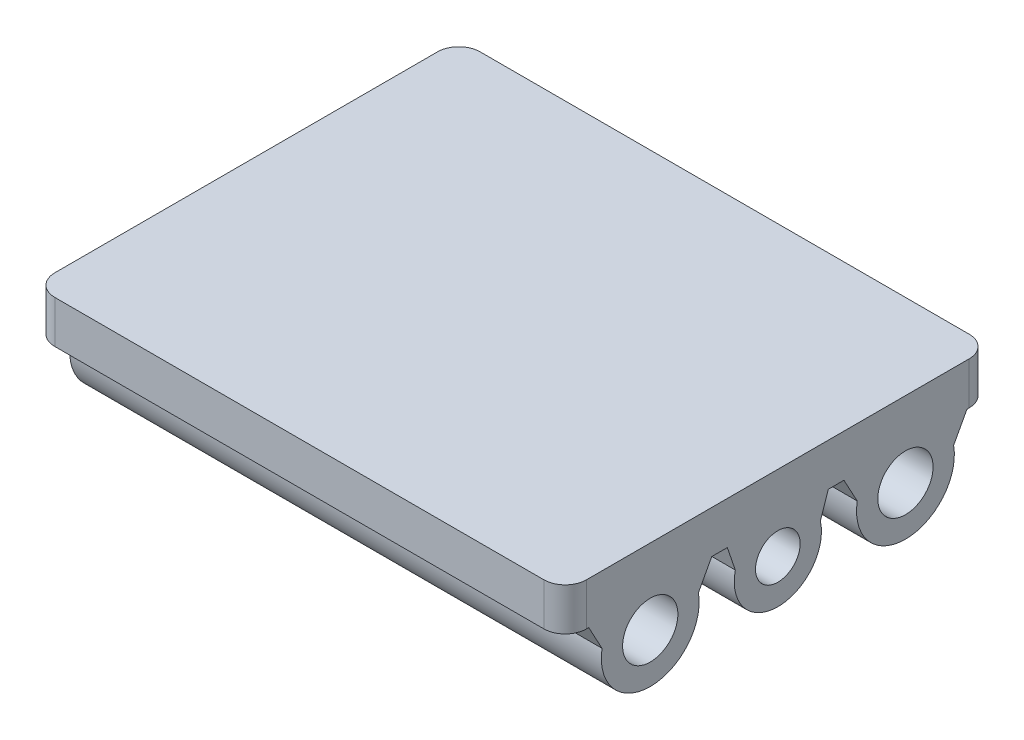
ISO-10303-21;
HEADER;
FILE_DESCRIPTION(('STEP AP214'),'2;1');
FILE_NAME('part.step','',(''),(''),'','','');
FILE_SCHEMA(('AUTOMOTIVE_DESIGN { 1 0 10303 214 1 1 1 1 }'));
ENDSEC;
DATA;
#1=APPLICATION_CONTEXT('core data for automotive mechanical design processes');
#2=APPLICATION_PROTOCOL_DEFINITION('international standard','automotive_design',2000,#1);
#3=PRODUCT_CONTEXT('',#1,'mechanical');
#4=PRODUCT('Part','Part','',(#3));
#5=PRODUCT_RELATED_PRODUCT_CATEGORY('part','',(#4));
#6=PRODUCT_DEFINITION_FORMATION('','',#4);
#7=PRODUCT_DEFINITION_CONTEXT('part definition',#1,'design');
#8=PRODUCT_DEFINITION('design','',#6,#7);
#9=PRODUCT_DEFINITION_SHAPE('','',#8);
#10=(LENGTH_UNIT() NAMED_UNIT(*) SI_UNIT(.MILLI.,.METRE.));
#11=(NAMED_UNIT(*) PLANE_ANGLE_UNIT() SI_UNIT($,.RADIAN.));
#12=(NAMED_UNIT(*) SI_UNIT($,.STERADIAN.) SOLID_ANGLE_UNIT());
#13=UNCERTAINTY_MEASURE_WITH_UNIT(LENGTH_MEASURE(1.E-05),#10,'distance_accuracy_value','');
#14=(GEOMETRIC_REPRESENTATION_CONTEXT(3) GLOBAL_UNCERTAINTY_ASSIGNED_CONTEXT((#13)) GLOBAL_UNIT_ASSIGNED_CONTEXT((#10,
#11,#12)) REPRESENTATION_CONTEXT('',''));
#15=CARTESIAN_POINT('',(0.,0.,0.));
#16=DIRECTION('',(0.,0.,1.));
#17=DIRECTION('',(1.,0.,0.));
#18=AXIS2_PLACEMENT_3D('',#15,#16,#17);
#19=CARTESIAN_POINT('',(0.,0.,0.));
#20=DIRECTION('',(0.,1.,0.));
#21=DIRECTION('',(0.,0.,1.));
#22=AXIS2_PLACEMENT_3D('',#19,#20,#21);
#23=PLANE('',#22);
#24=DIRECTION('',(0.,0.,1.));
#25=VECTOR('',#24,1.);
#26=CARTESIAN_POINT('',(-125.,0.,-100.));
#27=LINE('',#26,#25);
#28=CARTESIAN_POINT('',(-125.,0.,23.7559092261335));
#29=VERTEX_POINT('',#28);
#30=CARTESIAN_POINT('',(-125.,0.,31.0742017626146));
#31=VERTEX_POINT('',#30);
#32=EDGE_CURVE('E372',#29,#31,#27,.T.);
#33=ORIENTED_EDGE('',*,*,#32,.F.);
#34=DIRECTION('',(1.,0.,0.));
#35=VECTOR('',#34,1.);
#36=CARTESIAN_POINT('',(0.,0.,23.7559092261335));
#37=LINE('',#36,#35);
#38=CARTESIAN_POINT('',(125.,0.,23.7559092261335));
#39=VERTEX_POINT('',#38);
#40=EDGE_CURVE('E246',#29,#39,#37,.T.);
#41=ORIENTED_EDGE('',*,*,#40,.T.);
#42=DIRECTION('',(0.,0.,-1.));
#43=VECTOR('',#42,1.);
#44=CARTESIAN_POINT('',(125.,0.,-100.));
#45=LINE('',#44,#43);
#46=CARTESIAN_POINT('',(125.,0.,31.0742017626146));
#47=VERTEX_POINT('',#46);
#48=EDGE_CURVE('E381',#47,#39,#45,.T.);
#49=ORIENTED_EDGE('',*,*,#48,.F.);
#50=DIRECTION('',(-1.,0.,0.));
#51=VECTOR('',#50,1.);
#52=CARTESIAN_POINT('',(0.,0.,31.0742017626146));
#53=LINE('',#52,#51);
#54=EDGE_CURVE('E242',#47,#31,#53,.T.);
#55=ORIENTED_EDGE('',*,*,#54,.T.);
#56=EDGE_LOOP('',(#33,#41,#49,#55));
#57=FACE_BOUND('',#56,.T.);
#58=ADVANCED_FACE('F45',(#57),#23,.F.);
#59=DIRECTION('',(-1.,0.,0.));
#60=VECTOR('',#59,1.);
#61=CARTESIAN_POINT('',(-125.,0.,-100.));
#62=LINE('',#61,#60);
#63=CARTESIAN_POINT('',(115.,0.,-100.));
#64=VERTEX_POINT('',#63);
#65=CARTESIAN_POINT('',(-115.,0.,-100.));
#66=VERTEX_POINT('',#65);
#67=EDGE_CURVE('E375',#64,#66,#62,.T.);
#68=ORIENTED_EDGE('',*,*,#67,.F.);
#69=CARTESIAN_POINT('',(115.,0.,-90.));
#70=DIRECTION('',(0.,1.,0.));
#71=DIRECTION('',(0.,0.,1.));
#72=AXIS2_PLACEMENT_3D('',#69,#70,#71);
#73=CIRCLE('',#72,10.);
#74=CARTESIAN_POINT('',(125.,0.,-90.));
#75=VERTEX_POINT('',#74);
#76=EDGE_CURVE('E203',#64,#75,#73,.F.);
#77=ORIENTED_EDGE('',*,*,#76,.T.);
#78=CARTESIAN_POINT('',(125.,0.,-88.9257982373854));
#79=VERTEX_POINT('',#78);
#80=EDGE_CURVE('E189',#79,#75,#45,.T.);
#81=ORIENTED_EDGE('',*,*,#80,.F.);
#82=DIRECTION('',(-1.,0.,0.));
#83=VECTOR('',#82,1.);
#84=CARTESIAN_POINT('',(0.,0.,-88.9257982373854));
#85=LINE('',#84,#83);
#86=CARTESIAN_POINT('',(-125.,0.,-88.9257982373854));
#87=VERTEX_POINT('',#86);
#88=EDGE_CURVE('E202',#79,#87,#85,.T.);
#89=ORIENTED_EDGE('',*,*,#88,.T.);
#90=CARTESIAN_POINT('',(-125.,0.,-90.));
#91=VERTEX_POINT('',#90);
#92=EDGE_CURVE('E364',#91,#87,#27,.T.);
#93=ORIENTED_EDGE('',*,*,#92,.F.);
#94=CARTESIAN_POINT('',(-115.,0.,-90.));
#95=DIRECTION('',(0.,1.,0.));
#96=DIRECTION('',(0.,0.,1.));
#97=AXIS2_PLACEMENT_3D('',#94,#95,#96);
#98=CIRCLE('',#97,10.);
#99=EDGE_CURVE('E61',#91,#66,#98,.F.);
#100=ORIENTED_EDGE('',*,*,#99,.T.);
#101=EDGE_LOOP('',(#68,#77,#81,#89,#93,#100));
#102=FACE_BOUND('',#101,.T.);
#103=ADVANCED_FACE('F201',(#102),#23,.F.);
#104=CARTESIAN_POINT('',(-125.,0.,-31.0742017626146));
#105=VERTEX_POINT('',#104);
#106=CARTESIAN_POINT('',(-125.,0.,-23.7559092261335));
#107=VERTEX_POINT('',#106);
#108=EDGE_CURVE('E369',#105,#107,#27,.T.);
#109=ORIENTED_EDGE('',*,*,#108,.F.);
#110=DIRECTION('',(1.,0.,0.));
#111=VECTOR('',#110,1.);
#112=CARTESIAN_POINT('',(0.,0.,-31.0742017626146));
#113=LINE('',#112,#111);
#114=CARTESIAN_POINT('',(125.,0.,-31.0742017626146));
#115=VERTEX_POINT('',#114);
#116=EDGE_CURVE('E232',#105,#115,#113,.T.);
#117=ORIENTED_EDGE('',*,*,#116,.T.);
#118=CARTESIAN_POINT('',(125.,0.,-23.7559092261335));
#119=VERTEX_POINT('',#118);
#120=EDGE_CURVE('E205',#119,#115,#45,.T.);
#121=ORIENTED_EDGE('',*,*,#120,.F.);
#122=DIRECTION('',(-1.,0.,0.));
#123=VECTOR('',#122,1.);
#124=CARTESIAN_POINT('',(0.,0.,-23.7559092261335));
#125=LINE('',#124,#123);
#126=EDGE_CURVE('E228',#119,#107,#125,.T.);
#127=ORIENTED_EDGE('',*,*,#126,.T.);
#128=EDGE_LOOP('',(#109,#117,#121,#127));
#129=FACE_BOUND('',#128,.T.);
#130=ADVANCED_FACE('F436',(#129),#23,.F.);
#131=CARTESIAN_POINT('',(125.,20.,-100.));
#132=DIRECTION('',(-1.,0.,0.));
#133=DIRECTION('',(0.,0.,1.));
#134=AXIS2_PLACEMENT_3D('',#131,#132,#133);
#135=PLANE('',#134);
#136=DIRECTION('',(0.,0.,-1.));
#137=VECTOR('',#136,1.);
#138=CARTESIAN_POINT('',(125.,20.,-100.));
#139=LINE('',#138,#137);
#140=CARTESIAN_POINT('',(125.,20.,90.));
#141=VERTEX_POINT('',#140);
#142=CARTESIAN_POINT('',(125.,20.,-90.));
#143=VERTEX_POINT('',#142);
#144=EDGE_CURVE('E363',#141,#143,#139,.T.);
#145=ORIENTED_EDGE('',*,*,#144,.F.);
#146=DIRECTION('',(0.,-1.,0.));
#147=VECTOR('',#146,1.);
#148=CARTESIAN_POINT('',(125.,20.,90.));
#149=LINE('',#148,#147);
#150=CARTESIAN_POINT('',(125.,0.,90.));
#151=VERTEX_POINT('',#150);
#152=EDGE_CURVE('E294',#141,#151,#149,.T.);
#153=ORIENTED_EDGE('',*,*,#152,.T.);
#154=CARTESIAN_POINT('',(125.,0.,88.9257982373854));
#155=VERTEX_POINT('',#154);
#156=EDGE_CURVE('E208',#151,#155,#45,.T.);
#157=ORIENTED_EDGE('',*,*,#156,.T.);
#158=DIRECTION('',(0.,0.879546795665124,0.475812393948722));
#159=VECTOR('',#158,1.);
#160=CARTESIAN_POINT('',(125.,-63.5932566577629,54.5234675843087));
#161=LINE('',#160,#159);
#162=CARTESIAN_POINT('',(125.,-11.5769571786191,82.6629595380129));
#163=VERTEX_POINT('',#162);
#164=EDGE_CURVE('E285',#155,#163,#161,.F.);
#165=ORIENTED_EDGE('',*,*,#164,.T.);
#166=CARTESIAN_POINT('',(125.,-15.5,60.));
#167=DIRECTION('',(-1.,0.,0.));
#168=DIRECTION('',(0.,0.,1.));
#169=AXIS2_PLACEMENT_3D('',#166,#167,#168);
#170=CIRCLE('',#169,23.);
#171=CARTESIAN_POINT('',(125.,-11.5769571786191,37.337040461987));
#172=VERTEX_POINT('',#171);
#173=EDGE_CURVE('E415',#163,#172,#170,.F.);
#174=ORIENTED_EDGE('',*,*,#173,.T.);
#175=DIRECTION('',(0.,0.879546795665123,-0.475812393948722));
#176=VECTOR('',#175,1.);
#177=CARTESIAN_POINT('',(125.,70.3265086015489,-6.97064653957712));
#178=LINE('',#177,#176);
#179=EDGE_CURVE('E282',#172,#47,#178,.T.);
#180=ORIENTED_EDGE('',*,*,#179,.T.);
#181=ORIENTED_EDGE('',*,*,#48,.T.);
#182=DIRECTION('',(0.,0.946688793650123,0.322149542879196));
#183=VECTOR('',#182,1.);
#184=CARTESIAN_POINT('',(125.,-19.8181097906769,17.0119876199844));
#185=LINE('',#184,#183);
#186=CARTESIAN_POINT('',(125.,-11.0225071359586,20.005050803546));
#187=VERTEX_POINT('',#186);
#188=EDGE_CURVE('E273',#39,#187,#185,.F.);
#189=ORIENTED_EDGE('',*,*,#188,.T.);
#190=CARTESIAN_POINT('',(125.,-15.5,0.));
#191=DIRECTION('',(-1.,0.,0.));
#192=DIRECTION('',(0.,0.,1.));
#193=AXIS2_PLACEMENT_3D('',#190,#191,#192);
#194=CIRCLE('',#193,20.5);
#195=CARTESIAN_POINT('',(125.,-11.0225071359586,-20.0050508035461));
#196=VERTEX_POINT('',#195);
#197=EDGE_CURVE('E206',#187,#196,#194,.F.);
#198=ORIENTED_EDGE('',*,*,#197,.T.);
#199=DIRECTION('',(0.,0.946688793650123,-0.322149542879196));
#200=VECTOR('',#199,1.);
#201=CARTESIAN_POINT('',(125.,41.176962633972,-37.7680532154394));
#202=LINE('',#201,#200);
#203=EDGE_CURVE('E270',#196,#119,#202,.T.);
#204=ORIENTED_EDGE('',*,*,#203,.T.);
#205=ORIENTED_EDGE('',*,*,#120,.T.);
#206=DIRECTION('',(0.,0.879546795665124,0.475812393948722));
#207=VECTOR('',#206,1.);
#208=CARTESIAN_POINT('',(125.,-13.373344685521,-38.3088403074656));
#209=LINE('',#208,#207);
#210=CARTESIAN_POINT('',(125.,-11.5769571786191,-37.3370404619871));
#211=VERTEX_POINT('',#210);
#212=EDGE_CURVE('E197',#115,#211,#209,.F.);
#213=ORIENTED_EDGE('',*,*,#212,.T.);
#214=CARTESIAN_POINT('',(125.,-15.5,-60.));
#215=DIRECTION('',(-1.,0.,0.));
#216=DIRECTION('',(0.,0.,1.));
#217=AXIS2_PLACEMENT_3D('',#214,#215,#216);
#218=CIRCLE('',#217,23.);
#219=CARTESIAN_POINT('',(125.,-11.5769571786191,-82.662959538013));
#220=VERTEX_POINT('',#219);
#221=EDGE_CURVE('E192',#211,#220,#218,.F.);
#222=ORIENTED_EDGE('',*,*,#221,.T.);
#223=DIRECTION('',(0.,0.879546795665123,-0.475812393948722));
#224=VECTOR('',#223,1.);
#225=CARTESIAN_POINT('',(125.,20.106596629307,-99.8029544313515));
#226=LINE('',#225,#224);
#227=EDGE_CURVE('E184',#220,#79,#226,.T.);
#228=ORIENTED_EDGE('',*,*,#227,.T.);
#229=ORIENTED_EDGE('',*,*,#80,.T.);
#230=DIRECTION('',(0.,-1.,0.));
#231=VECTOR('',#230,1.);
#232=CARTESIAN_POINT('',(125.,20.,-90.));
#233=LINE('',#232,#231);
#234=EDGE_CURVE('E291',#75,#143,#233,.F.);
#235=ORIENTED_EDGE('',*,*,#234,.T.);
#236=EDGE_LOOP('',(#145,#153,#157,#165,#174,#180,#181,#189,#198,#204,#205,#213,#222,#228,#229,#235));
#237=FACE_BOUND('',#236,.T.);
#238=CARTESIAN_POINT('',(125.,-15.5,0.));
#239=DIRECTION('',(-1.,0.,0.));
#240=DIRECTION('',(0.,0.,1.));
#241=AXIS2_PLACEMENT_3D('',#238,#239,#240);
#242=CIRCLE('',#241,10.5);
#243=CARTESIAN_POINT('',(125.,-15.5,10.5));
#244=VERTEX_POINT('',#243);
#245=EDGE_CURVE('E385',#244,#244,#242,.F.);
#246=ORIENTED_EDGE('',*,*,#245,.F.);
#247=EDGE_LOOP('',(#246));
#248=FACE_BOUND('',#247,.T.);
#249=CARTESIAN_POINT('',(125.,-15.5,-60.));
#250=DIRECTION('',(-1.,0.,0.));
#251=DIRECTION('',(0.,0.,1.));
#252=AXIS2_PLACEMENT_3D('',#249,#250,#251);
#253=CIRCLE('',#252,13.);
#254=CARTESIAN_POINT('',(125.,-15.5,-47.));
#255=VERTEX_POINT('',#254);
#256=EDGE_CURVE('E403',#255,#255,#253,.F.);
#257=ORIENTED_EDGE('',*,*,#256,.F.);
#258=EDGE_LOOP('',(#257));
#259=FACE_BOUND('',#258,.T.);
#260=CARTESIAN_POINT('',(125.,-15.5,60.));
#261=DIRECTION('',(-1.,0.,0.));
#262=DIRECTION('',(0.,0.,1.));
#263=AXIS2_PLACEMENT_3D('',#260,#261,#262);
#264=CIRCLE('',#263,13.);
#265=CARTESIAN_POINT('',(125.,-15.5,73.));
#266=VERTEX_POINT('',#265);
#267=EDGE_CURVE('E419',#266,#266,#264,.F.);
#268=ORIENTED_EDGE('',*,*,#267,.F.);
#269=EDGE_LOOP('',(#268));
#270=FACE_BOUND('',#269,.T.);
#271=ADVANCED_FACE('F187',(#237,#248,#259,#270),#135,.F.);
#272=CARTESIAN_POINT('',(-125.,20.,-100.));
#273=DIRECTION('',(0.,0.,1.));
#274=DIRECTION('',(1.,0.,0.));
#275=AXIS2_PLACEMENT_3D('',#272,#273,#274);
#276=PLANE('',#275);
#277=DIRECTION('',(-1.,0.,0.));
#278=VECTOR('',#277,1.);
#279=CARTESIAN_POINT('',(-125.,20.,-100.));
#280=LINE('',#279,#278);
#281=CARTESIAN_POINT('',(115.,20.,-100.));
#282=VERTEX_POINT('',#281);
#283=CARTESIAN_POINT('',(-115.,20.,-100.));
#284=VERTEX_POINT('',#283);
#285=EDGE_CURVE('E351',#282,#284,#280,.T.);
#286=ORIENTED_EDGE('',*,*,#285,.F.);
#287=DIRECTION('',(0.,-1.,0.));
#288=VECTOR('',#287,1.);
#289=CARTESIAN_POINT('',(115.,20.,-100.));
#290=LINE('',#289,#288);
#291=EDGE_CURVE('E326',#282,#64,#290,.T.);
#292=ORIENTED_EDGE('',*,*,#291,.T.);
#293=ORIENTED_EDGE('',*,*,#67,.T.);
#294=DIRECTION('',(0.,-1.,0.));
#295=VECTOR('',#294,1.);
#296=CARTESIAN_POINT('',(-115.,20.,-100.));
#297=LINE('',#296,#295);
#298=EDGE_CURVE('E323',#66,#284,#297,.F.);
#299=ORIENTED_EDGE('',*,*,#298,.T.);
#300=EDGE_LOOP('',(#286,#292,#293,#299));
#301=FACE_BOUND('',#300,.T.);
#302=ADVANCED_FACE('F435',(#301),#276,.F.);
#303=CARTESIAN_POINT('',(-125.,20.,-100.));
#304=DIRECTION('',(1.,0.,0.));
#305=DIRECTION('',(0.,0.,-1.));
#306=AXIS2_PLACEMENT_3D('',#303,#304,#305);
#307=PLANE('',#306);
#308=DIRECTION('',(0.,0.,1.));
#309=VECTOR('',#308,1.);
#310=CARTESIAN_POINT('',(-125.,20.,-100.));
#311=LINE('',#310,#309);
#312=CARTESIAN_POINT('',(-125.,20.,-90.));
#313=VERTEX_POINT('',#312);
#314=CARTESIAN_POINT('',(-125.,20.,90.));
#315=VERTEX_POINT('',#314);
#316=EDGE_CURVE('E220',#313,#315,#311,.T.);
#317=ORIENTED_EDGE('',*,*,#316,.F.);
#318=DIRECTION('',(0.,-1.,0.));
#319=VECTOR('',#318,1.);
#320=CARTESIAN_POINT('',(-125.,20.,-90.));
#321=LINE('',#320,#319);
#322=EDGE_CURVE('E11',#313,#91,#321,.T.);
#323=ORIENTED_EDGE('',*,*,#322,.T.);
#324=ORIENTED_EDGE('',*,*,#92,.T.);
#325=DIRECTION('',(0.,-0.879546795665123,0.475812393948722));
#326=VECTOR('',#325,1.);
#327=CARTESIAN_POINT('',(-125.,20.106596629307,-99.8029544313515));
#328=LINE('',#327,#326);
#329=CARTESIAN_POINT('',(-125.,-11.5769571786191,-82.6629595380129));
#330=VERTEX_POINT('',#329);
#331=EDGE_CURVE('E198',#87,#330,#328,.T.);
#332=ORIENTED_EDGE('',*,*,#331,.T.);
#333=CARTESIAN_POINT('',(-125.,-15.5,-60.));
#334=DIRECTION('',(-1.,0.,0.));
#335=DIRECTION('',(0.,0.,1.));
#336=AXIS2_PLACEMENT_3D('',#333,#334,#335);
#337=CIRCLE('',#336,23.);
#338=CARTESIAN_POINT('',(-125.,-11.5769571786191,-37.337040461987));
#339=VERTEX_POINT('',#338);
#340=EDGE_CURVE('E408',#330,#339,#337,.T.);
#341=ORIENTED_EDGE('',*,*,#340,.T.);
#342=DIRECTION('',(0.,-0.879546795665124,-0.475812393948722));
#343=VECTOR('',#342,1.);
#344=CARTESIAN_POINT('',(-125.,-13.373344685521,-38.3088403074656));
#345=LINE('',#344,#343);
#346=EDGE_CURVE('E264',#339,#105,#345,.F.);
#347=ORIENTED_EDGE('',*,*,#346,.T.);
#348=ORIENTED_EDGE('',*,*,#108,.T.);
#349=DIRECTION('',(0.,-0.946688793650123,0.322149542879196));
#350=VECTOR('',#349,1.);
#351=CARTESIAN_POINT('',(-125.,41.176962633972,-37.7680532154394));
#352=LINE('',#351,#350);
#353=CARTESIAN_POINT('',(-125.,-11.0225071359586,-20.005050803546));
#354=VERTEX_POINT('',#353);
#355=EDGE_CURVE('E267',#107,#354,#352,.T.);
#356=ORIENTED_EDGE('',*,*,#355,.T.);
#357=CARTESIAN_POINT('',(-125.,-15.5,0.));
#358=DIRECTION('',(-1.,0.,0.));
#359=DIRECTION('',(0.,0.,1.));
#360=AXIS2_PLACEMENT_3D('',#357,#358,#359);
#361=CIRCLE('',#360,20.5);
#362=CARTESIAN_POINT('',(-125.,-11.0225071359586,20.0050508035461));
#363=VERTEX_POINT('',#362);
#364=EDGE_CURVE('E389',#354,#363,#361,.T.);
#365=ORIENTED_EDGE('',*,*,#364,.T.);
#366=DIRECTION('',(0.,-0.946688793650123,-0.322149542879196));
#367=VECTOR('',#366,1.);
#368=CARTESIAN_POINT('',(-125.,-19.8181097906769,17.0119876199845));
#369=LINE('',#368,#367);
#370=EDGE_CURVE('E276',#363,#29,#369,.F.);
#371=ORIENTED_EDGE('',*,*,#370,.T.);
#372=ORIENTED_EDGE('',*,*,#32,.T.);
#373=DIRECTION('',(0.,-0.879546795665123,0.475812393948722));
#374=VECTOR('',#373,1.);
#375=CARTESIAN_POINT('',(-125.,70.3265086015489,-6.97064653957707));
#376=LINE('',#375,#374);
#377=CARTESIAN_POINT('',(-125.,-11.5769571786191,37.3370404619871));
#378=VERTEX_POINT('',#377);
#379=EDGE_CURVE('E279',#31,#378,#376,.T.);
#380=ORIENTED_EDGE('',*,*,#379,.T.);
#381=CARTESIAN_POINT('',(-125.,-15.5,60.));
#382=DIRECTION('',(-1.,0.,0.));
#383=DIRECTION('',(0.,0.,-1.));
#384=AXIS2_PLACEMENT_3D('',#381,#382,#383);
#385=CIRCLE('',#384,23.);
#386=CARTESIAN_POINT('',(-125.,-11.5769571786191,82.6629595380129));
#387=VERTEX_POINT('',#386);
#388=EDGE_CURVE('E423',#378,#387,#385,.T.);
#389=ORIENTED_EDGE('',*,*,#388,.T.);
#390=DIRECTION('',(0.,-0.879546795665124,-0.475812393948722));
#391=VECTOR('',#390,1.);
#392=CARTESIAN_POINT('',(-125.,-63.5932566577629,54.5234675843088));
#393=LINE('',#392,#391);
#394=CARTESIAN_POINT('',(-125.,0.,88.9257982373854));
#395=VERTEX_POINT('',#394);
#396=EDGE_CURVE('E288',#387,#395,#393,.F.);
#397=ORIENTED_EDGE('',*,*,#396,.T.);
#398=CARTESIAN_POINT('',(-125.,0.,90.));
#399=VERTEX_POINT('',#398);
#400=EDGE_CURVE('E342',#395,#399,#27,.T.);
#401=ORIENTED_EDGE('',*,*,#400,.T.);
#402=DIRECTION('',(0.,-1.,0.));
#403=VECTOR('',#402,1.);
#404=CARTESIAN_POINT('',(-125.,20.,90.));
#405=LINE('',#404,#403);
#406=EDGE_CURVE('E54',#399,#315,#405,.F.);
#407=ORIENTED_EDGE('',*,*,#406,.T.);
#408=EDGE_LOOP('',(#317,#323,#324,#332,#341,#347,#348,#356,#365,#371,#372,#380,#389,#397,#401,#407));
#409=FACE_BOUND('',#408,.T.);
#410=CARTESIAN_POINT('',(-125.,-15.5,0.));
#411=DIRECTION('',(-1.,0.,0.));
#412=DIRECTION('',(0.,0.,1.));
#413=AXIS2_PLACEMENT_3D('',#410,#411,#412);
#414=CIRCLE('',#413,10.5);
#415=CARTESIAN_POINT('',(-125.,-15.5,10.5));
#416=VERTEX_POINT('',#415);
#417=EDGE_CURVE('E393',#416,#416,#414,.T.);
#418=ORIENTED_EDGE('',*,*,#417,.F.);
#419=EDGE_LOOP('',(#418));
#420=FACE_BOUND('',#419,.T.);
#421=CARTESIAN_POINT('',(-125.,-15.5,-60.));
#422=DIRECTION('',(-1.,0.,0.));
#423=DIRECTION('',(0.,0.,1.));
#424=AXIS2_PLACEMENT_3D('',#421,#422,#423);
#425=CIRCLE('',#424,13.);
#426=CARTESIAN_POINT('',(-125.,-15.5,-47.));
#427=VERTEX_POINT('',#426);
#428=EDGE_CURVE('E397',#427,#427,#425,.T.);
#429=ORIENTED_EDGE('',*,*,#428,.F.);
#430=EDGE_LOOP('',(#429));
#431=FACE_BOUND('',#430,.T.);
#432=CARTESIAN_POINT('',(-125.,-15.5,60.));
#433=DIRECTION('',(-1.,0.,0.));
#434=DIRECTION('',(0.,0.,-1.));
#435=AXIS2_PLACEMENT_3D('',#432,#433,#434);
#436=CIRCLE('',#435,13.);
#437=CARTESIAN_POINT('',(-125.,-15.5,47.));
#438=VERTEX_POINT('',#437);
#439=EDGE_CURVE('E404',#438,#438,#436,.T.);
#440=ORIENTED_EDGE('',*,*,#439,.F.);
#441=EDGE_LOOP('',(#440));
#442=FACE_BOUND('',#441,.T.);
#443=ADVANCED_FACE('F339',(#409,#420,#431,#442),#307,.F.);
#444=CARTESIAN_POINT('',(-125.,20.,100.));
#445=DIRECTION('',(0.,0.,-1.));
#446=DIRECTION('',(-1.,0.,0.));
#447=AXIS2_PLACEMENT_3D('',#444,#445,#446);
#448=PLANE('',#447);
#449=DIRECTION('',(1.,0.,0.));
#450=VECTOR('',#449,1.);
#451=CARTESIAN_POINT('',(-125.,0.,100.));
#452=LINE('',#451,#450);
#453=CARTESIAN_POINT('',(-115.,0.,100.));
#454=VERTEX_POINT('',#453);
#455=CARTESIAN_POINT('',(115.,0.,100.));
#456=VERTEX_POINT('',#455);
#457=EDGE_CURVE('E223',#454,#456,#452,.T.);
#458=ORIENTED_EDGE('',*,*,#457,.T.);
#459=DIRECTION('',(0.,-1.,0.));
#460=VECTOR('',#459,1.);
#461=CARTESIAN_POINT('',(115.,20.,100.));
#462=LINE('',#461,#460);
#463=CARTESIAN_POINT('',(115.,20.,100.));
#464=VERTEX_POINT('',#463);
#465=EDGE_CURVE('E308',#456,#464,#462,.F.);
#466=ORIENTED_EDGE('',*,*,#465,.T.);
#467=DIRECTION('',(1.,0.,0.));
#468=VECTOR('',#467,1.);
#469=CARTESIAN_POINT('',(-125.,20.,100.));
#470=LINE('',#469,#468);
#471=CARTESIAN_POINT('',(-115.,20.,100.));
#472=VERTEX_POINT('',#471);
#473=EDGE_CURVE('E213',#472,#464,#470,.T.);
#474=ORIENTED_EDGE('',*,*,#473,.F.);
#475=DIRECTION('',(0.,-1.,0.));
#476=VECTOR('',#475,1.);
#477=CARTESIAN_POINT('',(-115.,20.,100.));
#478=LINE('',#477,#476);
#479=EDGE_CURVE('E304',#472,#454,#478,.T.);
#480=ORIENTED_EDGE('',*,*,#479,.T.);
#481=EDGE_LOOP('',(#458,#466,#474,#480));
#482=FACE_BOUND('',#481,.T.);
#483=ADVANCED_FACE('F357',(#482),#448,.F.);
#484=CARTESIAN_POINT('',(0.,20.,0.));
#485=DIRECTION('',(0.,1.,0.));
#486=DIRECTION('',(0.,0.,1.));
#487=AXIS2_PLACEMENT_3D('',#484,#485,#486);
#488=PLANE('',#487);
#489=ORIENTED_EDGE('',*,*,#473,.T.);
#490=CARTESIAN_POINT('',(115.,20.,90.));
#491=DIRECTION('',(0.,1.,0.));
#492=DIRECTION('',(0.,0.,1.));
#493=AXIS2_PLACEMENT_3D('',#490,#491,#492);
#494=CIRCLE('',#493,10.);
#495=EDGE_CURVE('E320',#464,#141,#494,.T.);
#496=ORIENTED_EDGE('',*,*,#495,.T.);
#497=ORIENTED_EDGE('',*,*,#144,.T.);
#498=CARTESIAN_POINT('',(115.,20.,-90.));
#499=DIRECTION('',(0.,1.,0.));
#500=DIRECTION('',(0.,0.,1.));
#501=AXIS2_PLACEMENT_3D('',#498,#499,#500);
#502=CIRCLE('',#501,10.);
#503=EDGE_CURVE('E317',#143,#282,#502,.T.);
#504=ORIENTED_EDGE('',*,*,#503,.T.);
#505=ORIENTED_EDGE('',*,*,#285,.T.);
#506=CARTESIAN_POINT('',(-115.,20.,-90.));
#507=DIRECTION('',(0.,1.,0.));
#508=DIRECTION('',(0.,0.,1.));
#509=AXIS2_PLACEMENT_3D('',#506,#507,#508);
#510=CIRCLE('',#509,10.);
#511=EDGE_CURVE('E314',#284,#313,#510,.T.);
#512=ORIENTED_EDGE('',*,*,#511,.T.);
#513=ORIENTED_EDGE('',*,*,#316,.T.);
#514=CARTESIAN_POINT('',(-115.,20.,90.));
#515=DIRECTION('',(0.,1.,0.));
#516=DIRECTION('',(0.,0.,1.));
#517=AXIS2_PLACEMENT_3D('',#514,#515,#516);
#518=CIRCLE('',#517,10.);
#519=EDGE_CURVE('E311',#315,#472,#518,.T.);
#520=ORIENTED_EDGE('',*,*,#519,.T.);
#521=EDGE_LOOP('',(#489,#496,#497,#504,#505,#512,#513,#520));
#522=FACE_BOUND('',#521,.T.);
#523=ADVANCED_FACE('F346',(#522),#488,.T.);
#524=ORIENTED_EDGE('',*,*,#156,.F.);
#525=CARTESIAN_POINT('',(115.,0.,90.));
#526=DIRECTION('',(0.,1.,0.));
#527=DIRECTION('',(0.,0.,1.));
#528=AXIS2_PLACEMENT_3D('',#525,#526,#527);
#529=CIRCLE('',#528,10.);
#530=EDGE_CURVE('E301',#151,#456,#529,.F.);
#531=ORIENTED_EDGE('',*,*,#530,.T.);
#532=ORIENTED_EDGE('',*,*,#457,.F.);
#533=CARTESIAN_POINT('',(-115.,0.,90.));
#534=DIRECTION('',(0.,1.,0.));
#535=DIRECTION('',(0.,0.,1.));
#536=AXIS2_PLACEMENT_3D('',#533,#534,#535);
#537=CIRCLE('',#536,10.);
#538=EDGE_CURVE('E298',#454,#399,#537,.F.);
#539=ORIENTED_EDGE('',*,*,#538,.T.);
#540=ORIENTED_EDGE('',*,*,#400,.F.);
#541=DIRECTION('',(1.,0.,0.));
#542=VECTOR('',#541,1.);
#543=CARTESIAN_POINT('',(0.,0.,88.9257982373854));
#544=LINE('',#543,#542);
#545=EDGE_CURVE('E256',#395,#155,#544,.T.);
#546=ORIENTED_EDGE('',*,*,#545,.T.);
#547=EDGE_LOOP('',(#524,#531,#532,#539,#540,#546));
#548=FACE_BOUND('',#547,.T.);
#549=ADVANCED_FACE('F361',(#548),#23,.F.);
#550=CARTESIAN_POINT('',(190.053823869162,-15.5,0.));
#551=DIRECTION('',(-1.,0.,0.));
#552=DIRECTION('',(0.,0.,1.));
#553=AXIS2_PLACEMENT_3D('',#550,#551,#552);
#554=CYLINDRICAL_SURFACE('',#553,20.5);
#555=ORIENTED_EDGE('',*,*,#364,.F.);
#556=DIRECTION('',(-1.,0.,0.));
#557=VECTOR('',#556,1.);
#558=CARTESIAN_POINT('',(190.053823869162,-11.0225071359586,-20.0050508035461));
#559=LINE('',#558,#557);
#560=EDGE_CURVE('E239',#354,#196,#559,.F.);
#561=ORIENTED_EDGE('',*,*,#560,.T.);
#562=ORIENTED_EDGE('',*,*,#197,.F.);
#563=DIRECTION('',(-1.,0.,0.));
#564=VECTOR('',#563,1.);
#565=CARTESIAN_POINT('',(190.053823869162,-11.0225071359586,20.005050803546));
#566=LINE('',#565,#564);
#567=EDGE_CURVE('E236',#187,#363,#566,.T.);
#568=ORIENTED_EDGE('',*,*,#567,.T.);
#569=EDGE_LOOP('',(#555,#561,#562,#568));
#570=FACE_BOUND('',#569,.T.);
#571=ADVANCED_FACE('F455',(#570),#554,.T.);
#572=CARTESIAN_POINT('',(190.053823869162,-15.5,0.));
#573=DIRECTION('',(-1.,0.,0.));
#574=DIRECTION('',(0.,0.,1.));
#575=AXIS2_PLACEMENT_3D('',#572,#573,#574);
#576=CYLINDRICAL_SURFACE('',#575,10.5);
#577=ORIENTED_EDGE('',*,*,#245,.T.);
#578=EDGE_LOOP('',(#577));
#579=FACE_BOUND('',#578,.T.);
#580=ORIENTED_EDGE('',*,*,#417,.T.);
#581=EDGE_LOOP('',(#580));
#582=FACE_BOUND('',#581,.T.);
#583=ADVANCED_FACE('F460',(#579,#582),#576,.F.);
#584=CARTESIAN_POINT('',(190.053823869162,-15.5,-60.));
#585=DIRECTION('',(-1.,0.,0.));
#586=DIRECTION('',(0.,0.,1.));
#587=AXIS2_PLACEMENT_3D('',#584,#585,#586);
#588=CYLINDRICAL_SURFACE('',#587,23.);
#589=ORIENTED_EDGE('',*,*,#340,.F.);
#590=DIRECTION('',(-1.,0.,0.));
#591=VECTOR('',#590,1.);
#592=CARTESIAN_POINT('',(190.053823869162,-11.5769571786191,-82.662959538013));
#593=LINE('',#592,#591);
#594=EDGE_CURVE('E217',#330,#220,#593,.F.);
#595=ORIENTED_EDGE('',*,*,#594,.T.);
#596=ORIENTED_EDGE('',*,*,#221,.F.);
#597=DIRECTION('',(-1.,0.,0.));
#598=VECTOR('',#597,1.);
#599=CARTESIAN_POINT('',(190.053823869162,-11.5769571786191,-37.3370404619871));
#600=LINE('',#599,#598);
#601=EDGE_CURVE('E212',#211,#339,#600,.T.);
#602=ORIENTED_EDGE('',*,*,#601,.T.);
#603=EDGE_LOOP('',(#589,#595,#596,#602));
#604=FACE_BOUND('',#603,.T.);
#605=ADVANCED_FACE('F469',(#604),#588,.T.);
#606=CARTESIAN_POINT('',(190.053823869162,-15.5,-60.));
#607=DIRECTION('',(-1.,0.,0.));
#608=DIRECTION('',(0.,0.,1.));
#609=AXIS2_PLACEMENT_3D('',#606,#607,#608);
#610=CYLINDRICAL_SURFACE('',#609,13.);
#611=ORIENTED_EDGE('',*,*,#256,.T.);
#612=EDGE_LOOP('',(#611));
#613=FACE_BOUND('',#612,.T.);
#614=ORIENTED_EDGE('',*,*,#428,.T.);
#615=EDGE_LOOP('',(#614));
#616=FACE_BOUND('',#615,.T.);
#617=ADVANCED_FACE('F471',(#613,#616),#610,.F.);
#618=CARTESIAN_POINT('',(190.053823869162,-15.5,60.));
#619=DIRECTION('',(-1.,0.,0.));
#620=DIRECTION('',(0.,0.,1.));
#621=AXIS2_PLACEMENT_3D('',#618,#619,#620);
#622=CYLINDRICAL_SURFACE('',#621,23.);
#623=ORIENTED_EDGE('',*,*,#388,.F.);
#624=DIRECTION('',(-1.,0.,0.));
#625=VECTOR('',#624,1.);
#626=CARTESIAN_POINT('',(190.053823869162,-11.5769571786191,37.337040461987));
#627=LINE('',#626,#625);
#628=EDGE_CURVE('E253',#378,#172,#627,.F.);
#629=ORIENTED_EDGE('',*,*,#628,.T.);
#630=ORIENTED_EDGE('',*,*,#173,.F.);
#631=DIRECTION('',(-1.,0.,0.));
#632=VECTOR('',#631,1.);
#633=CARTESIAN_POINT('',(190.053823869162,-11.5769571786191,82.6629595380129));
#634=LINE('',#633,#632);
#635=EDGE_CURVE('E250',#163,#387,#634,.T.);
#636=ORIENTED_EDGE('',*,*,#635,.T.);
#637=EDGE_LOOP('',(#623,#629,#630,#636));
#638=FACE_BOUND('',#637,.T.);
#639=ADVANCED_FACE('F474',(#638),#622,.T.);
#640=CARTESIAN_POINT('',(190.053823869162,-15.5,60.));
#641=DIRECTION('',(-1.,0.,0.));
#642=DIRECTION('',(0.,0.,1.));
#643=AXIS2_PLACEMENT_3D('',#640,#641,#642);
#644=CYLINDRICAL_SURFACE('',#643,13.);
#645=ORIENTED_EDGE('',*,*,#267,.T.);
#646=EDGE_LOOP('',(#645));
#647=FACE_BOUND('',#646,.T.);
#648=ORIENTED_EDGE('',*,*,#439,.T.);
#649=EDGE_LOOP('',(#648));
#650=FACE_BOUND('',#649,.T.);
#651=ADVANCED_FACE('F431',(#647,#650),#644,.F.);
#652=CARTESIAN_POINT('',(190.053823869162,0.,-88.9257982373855));
#653=DIRECTION('',(0.,0.475812393948722,0.879546795665123));
#654=DIRECTION('',(-1.,0.,0.));
#655=AXIS2_PLACEMENT_3D('',#652,#653,#654);
#656=PLANE('',#655);
#657=ORIENTED_EDGE('',*,*,#227,.F.);
#658=ORIENTED_EDGE('',*,*,#594,.F.);
#659=ORIENTED_EDGE('',*,*,#331,.F.);
#660=ORIENTED_EDGE('',*,*,#88,.F.);
#661=EDGE_LOOP('',(#657,#658,#659,#660));
#662=FACE_BOUND('',#661,.T.);
#663=ADVANCED_FACE('F210',(#662),#656,.F.);
#664=CARTESIAN_POINT('',(190.053823869162,0.,-31.0742017626146));
#665=DIRECTION('',(0.,-0.475812393948722,0.879546795665124));
#666=DIRECTION('',(-1.,0.,0.));
#667=AXIS2_PLACEMENT_3D('',#664,#665,#666);
#668=PLANE('',#667);
#669=ORIENTED_EDGE('',*,*,#346,.F.);
#670=ORIENTED_EDGE('',*,*,#601,.F.);
#671=ORIENTED_EDGE('',*,*,#212,.F.);
#672=ORIENTED_EDGE('',*,*,#116,.F.);
#673=EDGE_LOOP('',(#669,#670,#671,#672));
#674=FACE_BOUND('',#673,.T.);
#675=ADVANCED_FACE('F522',(#674),#668,.T.);
#676=CARTESIAN_POINT('',(190.053823869162,0.,-23.7559092261336));
#677=DIRECTION('',(0.,0.322149542879196,0.946688793650123));
#678=DIRECTION('',(-1.,0.,0.));
#679=AXIS2_PLACEMENT_3D('',#676,#677,#678);
#680=PLANE('',#679);
#681=ORIENTED_EDGE('',*,*,#203,.F.);
#682=ORIENTED_EDGE('',*,*,#560,.F.);
#683=ORIENTED_EDGE('',*,*,#355,.F.);
#684=ORIENTED_EDGE('',*,*,#126,.F.);
#685=EDGE_LOOP('',(#681,#682,#683,#684));
#686=FACE_BOUND('',#685,.T.);
#687=ADVANCED_FACE('F506',(#686),#680,.F.);
#688=CARTESIAN_POINT('',(190.053823869162,0.,23.7559092261335));
#689=DIRECTION('',(0.,-0.322149542879196,0.946688793650123));
#690=DIRECTION('',(-1.,0.,0.));
#691=AXIS2_PLACEMENT_3D('',#688,#689,#690);
#692=PLANE('',#691);
#693=ORIENTED_EDGE('',*,*,#370,.F.);
#694=ORIENTED_EDGE('',*,*,#567,.F.);
#695=ORIENTED_EDGE('',*,*,#188,.F.);
#696=ORIENTED_EDGE('',*,*,#40,.F.);
#697=EDGE_LOOP('',(#693,#694,#695,#696));
#698=FACE_BOUND('',#697,.T.);
#699=ADVANCED_FACE('F513',(#698),#692,.T.);
#700=CARTESIAN_POINT('',(190.053823869162,0.,31.0742017626145));
#701=DIRECTION('',(0.,0.475812393948722,0.879546795665123));
#702=DIRECTION('',(-1.,0.,0.));
#703=AXIS2_PLACEMENT_3D('',#700,#701,#702);
#704=PLANE('',#703);
#705=ORIENTED_EDGE('',*,*,#179,.F.);
#706=ORIENTED_EDGE('',*,*,#628,.F.);
#707=ORIENTED_EDGE('',*,*,#379,.F.);
#708=ORIENTED_EDGE('',*,*,#54,.F.);
#709=EDGE_LOOP('',(#705,#706,#707,#708));
#710=FACE_BOUND('',#709,.T.);
#711=ADVANCED_FACE('F492',(#710),#704,.F.);
#712=CARTESIAN_POINT('',(190.053823869162,0.,88.9257982373854));
#713=DIRECTION('',(0.,-0.475812393948722,0.879546795665124));
#714=DIRECTION('',(-1.,0.,0.));
#715=AXIS2_PLACEMENT_3D('',#712,#713,#714);
#716=PLANE('',#715);
#717=ORIENTED_EDGE('',*,*,#396,.F.);
#718=ORIENTED_EDGE('',*,*,#635,.F.);
#719=ORIENTED_EDGE('',*,*,#164,.F.);
#720=ORIENTED_EDGE('',*,*,#545,.F.);
#721=EDGE_LOOP('',(#717,#718,#719,#720));
#722=FACE_BOUND('',#721,.T.);
#723=ADVANCED_FACE('F520',(#722),#716,.T.);
#724=CARTESIAN_POINT('',(115.,20.,90.));
#725=DIRECTION('',(0.,-1.,0.));
#726=DIRECTION('',(0.,0.,-1.));
#727=AXIS2_PLACEMENT_3D('',#724,#725,#726);
#728=CYLINDRICAL_SURFACE('',#727,10.);
#729=ORIENTED_EDGE('',*,*,#495,.F.);
#730=ORIENTED_EDGE('',*,*,#465,.F.);
#731=ORIENTED_EDGE('',*,*,#530,.F.);
#732=ORIENTED_EDGE('',*,*,#152,.F.);
#733=EDGE_LOOP('',(#729,#730,#731,#732));
#734=FACE_BOUND('',#733,.T.);
#735=ADVANCED_FACE('F538',(#734),#728,.T.);
#736=CARTESIAN_POINT('',(115.,20.,-90.));
#737=DIRECTION('',(0.,-1.,0.));
#738=DIRECTION('',(0.,0.,-1.));
#739=AXIS2_PLACEMENT_3D('',#736,#737,#738);
#740=CYLINDRICAL_SURFACE('',#739,10.);
#741=ORIENTED_EDGE('',*,*,#503,.F.);
#742=ORIENTED_EDGE('',*,*,#234,.F.);
#743=ORIENTED_EDGE('',*,*,#76,.F.);
#744=ORIENTED_EDGE('',*,*,#291,.F.);
#745=EDGE_LOOP('',(#741,#742,#743,#744));
#746=FACE_BOUND('',#745,.T.);
#747=ADVANCED_FACE('F542',(#746),#740,.T.);
#748=CARTESIAN_POINT('',(-115.,20.,-90.));
#749=DIRECTION('',(0.,-1.,0.));
#750=DIRECTION('',(0.,0.,-1.));
#751=AXIS2_PLACEMENT_3D('',#748,#749,#750);
#752=CYLINDRICAL_SURFACE('',#751,10.);
#753=ORIENTED_EDGE('',*,*,#511,.F.);
#754=ORIENTED_EDGE('',*,*,#298,.F.);
#755=ORIENTED_EDGE('',*,*,#99,.F.);
#756=ORIENTED_EDGE('',*,*,#322,.F.);
#757=EDGE_LOOP('',(#753,#754,#755,#756));
#758=FACE_BOUND('',#757,.T.);
#759=ADVANCED_FACE('F545',(#758),#752,.T.);
#760=CARTESIAN_POINT('',(-115.,20.,90.));
#761=DIRECTION('',(0.,-1.,0.));
#762=DIRECTION('',(0.,0.,-1.));
#763=AXIS2_PLACEMENT_3D('',#760,#761,#762);
#764=CYLINDRICAL_SURFACE('',#763,10.);
#765=ORIENTED_EDGE('',*,*,#519,.F.);
#766=ORIENTED_EDGE('',*,*,#406,.F.);
#767=ORIENTED_EDGE('',*,*,#538,.F.);
#768=ORIENTED_EDGE('',*,*,#479,.F.);
#769=EDGE_LOOP('',(#765,#766,#767,#768));
#770=FACE_BOUND('',#769,.T.);
#771=ADVANCED_FACE('F47',(#770),#764,.T.);
#772=CLOSED_SHELL('',(#58,#103,#130,#271,#302,#443,#483,#523,#549,#571,#583,#605,#617,#639,#651,
#663,#675,#687,#699,#711,#723,#735,#747,#759,#771));
#773=MANIFOLD_SOLID_BREP('B2',#772);
#774=ADVANCED_BREP_SHAPE_REPRESENTATION('',(#18,#773),#14);
#775=SHAPE_DEFINITION_REPRESENTATION(#9,#774);
ENDSEC;
END-ISO-10303-21;
